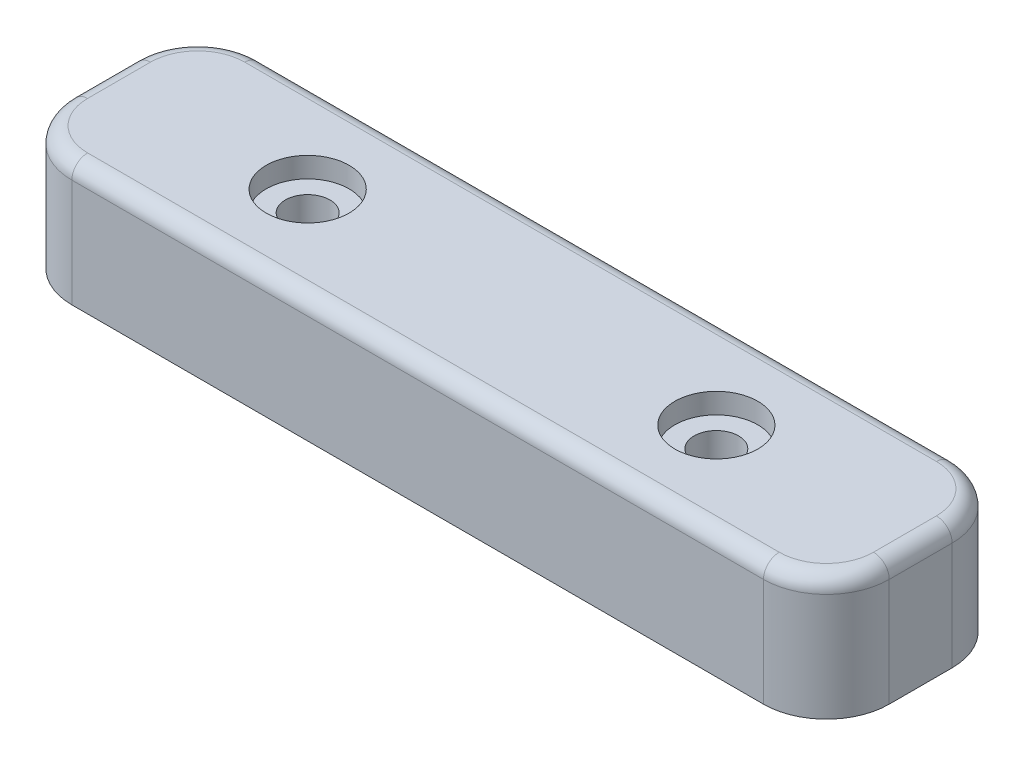
ISO-10303-21;
HEADER;
FILE_DESCRIPTION(('STEP AP214'),'2;1');
FILE_NAME('part.step','',(''),(''),'','','');
FILE_SCHEMA(('AUTOMOTIVE_DESIGN { 1 0 10303 214 1 1 1 1 }'));
ENDSEC;
DATA;
#1=APPLICATION_CONTEXT('core data for automotive mechanical design processes');
#2=APPLICATION_PROTOCOL_DEFINITION('international standard','automotive_design',2000,#1);
#3=PRODUCT_CONTEXT('',#1,'mechanical');
#4=PRODUCT('Part','Part','',(#3));
#5=PRODUCT_RELATED_PRODUCT_CATEGORY('part','',(#4));
#6=PRODUCT_DEFINITION_FORMATION('','',#4);
#7=PRODUCT_DEFINITION_CONTEXT('part definition',#1,'design');
#8=PRODUCT_DEFINITION('design','',#6,#7);
#9=PRODUCT_DEFINITION_SHAPE('','',#8);
#10=(LENGTH_UNIT() NAMED_UNIT(*) SI_UNIT(.MILLI.,.METRE.));
#11=(NAMED_UNIT(*) PLANE_ANGLE_UNIT() SI_UNIT($,.RADIAN.));
#12=(NAMED_UNIT(*) SI_UNIT($,.STERADIAN.) SOLID_ANGLE_UNIT());
#13=UNCERTAINTY_MEASURE_WITH_UNIT(LENGTH_MEASURE(1.E-05),#10,'distance_accuracy_value','');
#14=(GEOMETRIC_REPRESENTATION_CONTEXT(3) GLOBAL_UNCERTAINTY_ASSIGNED_CONTEXT((#13)) GLOBAL_UNIT_ASSIGNED_CONTEXT((#10,
#11,#12)) REPRESENTATION_CONTEXT('',''));
#15=CARTESIAN_POINT('',(0.,0.,0.));
#16=DIRECTION('',(0.,0.,1.));
#17=DIRECTION('',(1.,0.,0.));
#18=AXIS2_PLACEMENT_3D('',#15,#16,#17);
#19=CARTESIAN_POINT('',(0.,10.,0.));
#20=DIRECTION('',(1.,0.,0.));
#21=DIRECTION('',(0.,0.,-1.));
#22=AXIS2_PLACEMENT_3D('',#19,#20,#21);
#23=PLANE('',#22);
#24=DIRECTION('',(0.,-1.,0.));
#25=VECTOR('',#24,1.);
#26=CARTESIAN_POINT('',(0.,10.,10.16));
#27=LINE('',#26,#25);
#28=CARTESIAN_POINT('',(0.,0.,10.16));
#29=VERTEX_POINT('',#28);
#30=CARTESIAN_POINT('',(0.,8.73,10.16));
#31=VERTEX_POINT('',#30);
#32=EDGE_CURVE('E144',#29,#31,#27,.F.);
#33=ORIENTED_EDGE('',*,*,#32,.T.);
#34=DIRECTION('',(0.,0.,1.));
#35=VECTOR('',#34,1.);
#36=CARTESIAN_POINT('',(0.,8.73,5.08));
#37=LINE('',#36,#35);
#38=CARTESIAN_POINT('',(0.,8.73,5.08));
#39=VERTEX_POINT('',#38);
#40=EDGE_CURVE('E201',#31,#39,#37,.F.);
#41=ORIENTED_EDGE('',*,*,#40,.T.);
#42=DIRECTION('',(0.,-1.,0.));
#43=VECTOR('',#42,1.);
#44=CARTESIAN_POINT('',(0.,10.,5.08));
#45=LINE('',#44,#43);
#46=CARTESIAN_POINT('',(0.,0.,5.08));
#47=VERTEX_POINT('',#46);
#48=EDGE_CURVE('E148',#39,#47,#45,.T.);
#49=ORIENTED_EDGE('',*,*,#48,.T.);
#50=DIRECTION('',(0.,0.,1.));
#51=VECTOR('',#50,1.);
#52=CARTESIAN_POINT('',(0.,0.,0.));
#53=LINE('',#52,#51);
#54=EDGE_CURVE('E156',#47,#29,#53,.T.);
#55=ORIENTED_EDGE('',*,*,#54,.T.);
#56=EDGE_LOOP('',(#33,#41,#49,#55));
#57=FACE_BOUND('',#56,.T.);
#58=ADVANCED_FACE('F37',(#57),#23,.F.);
#59=CARTESIAN_POINT('',(0.,10.,15.24));
#60=DIRECTION('',(0.,0.,-1.));
#61=DIRECTION('',(-1.,0.,0.));
#62=AXIS2_PLACEMENT_3D('',#59,#60,#61);
#63=PLANE('',#62);
#64=DIRECTION('',(0.,-1.,0.));
#65=VECTOR('',#64,1.);
#66=CARTESIAN_POINT('',(60.96,10.,15.24));
#67=LINE('',#66,#65);
#68=CARTESIAN_POINT('',(60.96,0.,15.24));
#69=VERTEX_POINT('',#68);
#70=CARTESIAN_POINT('',(60.96,8.73,15.24));
#71=VERTEX_POINT('',#70);
#72=EDGE_CURVE('E138',#69,#71,#67,.F.);
#73=ORIENTED_EDGE('',*,*,#72,.T.);
#74=DIRECTION('',(1.,0.,0.));
#75=VECTOR('',#74,1.);
#76=CARTESIAN_POINT('',(5.08,8.73,15.24));
#77=LINE('',#76,#75);
#78=CARTESIAN_POINT('',(5.08,8.73,15.24));
#79=VERTEX_POINT('',#78);
#80=EDGE_CURVE('E11',#71,#79,#77,.F.);
#81=ORIENTED_EDGE('',*,*,#80,.T.);
#82=DIRECTION('',(0.,-1.,0.));
#83=VECTOR('',#82,1.);
#84=CARTESIAN_POINT('',(5.08,10.,15.24));
#85=LINE('',#84,#83);
#86=CARTESIAN_POINT('',(5.08,0.,15.24));
#87=VERTEX_POINT('',#86);
#88=EDGE_CURVE('E128',#79,#87,#85,.T.);
#89=ORIENTED_EDGE('',*,*,#88,.T.);
#90=DIRECTION('',(1.,0.,0.));
#91=VECTOR('',#90,1.);
#92=CARTESIAN_POINT('',(0.,0.,15.24));
#93=LINE('',#92,#91);
#94=EDGE_CURVE('E132',#87,#69,#93,.T.);
#95=ORIENTED_EDGE('',*,*,#94,.T.);
#96=EDGE_LOOP('',(#73,#81,#89,#95));
#97=FACE_BOUND('',#96,.T.);
#98=ADVANCED_FACE('F130',(#97),#63,.F.);
#99=CARTESIAN_POINT('',(66.04,10.,0.));
#100=DIRECTION('',(-1.,0.,0.));
#101=DIRECTION('',(0.,0.,1.));
#102=AXIS2_PLACEMENT_3D('',#99,#100,#101);
#103=PLANE('',#102);
#104=DIRECTION('',(0.,-1.,0.));
#105=VECTOR('',#104,1.);
#106=CARTESIAN_POINT('',(66.04,10.,5.08));
#107=LINE('',#106,#105);
#108=CARTESIAN_POINT('',(66.04,0.,5.08));
#109=VERTEX_POINT('',#108);
#110=CARTESIAN_POINT('',(66.04,8.73,5.08));
#111=VERTEX_POINT('',#110);
#112=EDGE_CURVE('E178',#109,#111,#107,.F.);
#113=ORIENTED_EDGE('',*,*,#112,.T.);
#114=DIRECTION('',(0.,0.,-1.));
#115=VECTOR('',#114,1.);
#116=CARTESIAN_POINT('',(66.04,8.73,10.16));
#117=LINE('',#116,#115);
#118=CARTESIAN_POINT('',(66.04,8.73,10.16));
#119=VERTEX_POINT('',#118);
#120=EDGE_CURVE('E61',#111,#119,#117,.F.);
#121=ORIENTED_EDGE('',*,*,#120,.T.);
#122=DIRECTION('',(0.,-1.,0.));
#123=VECTOR('',#122,1.);
#124=CARTESIAN_POINT('',(66.04,10.,10.16));
#125=LINE('',#124,#123);
#126=CARTESIAN_POINT('',(66.04,0.,10.16));
#127=VERTEX_POINT('',#126);
#128=EDGE_CURVE('E180',#119,#127,#125,.T.);
#129=ORIENTED_EDGE('',*,*,#128,.T.);
#130=DIRECTION('',(0.,0.,-1.));
#131=VECTOR('',#130,1.);
#132=CARTESIAN_POINT('',(66.04,0.,0.));
#133=LINE('',#132,#131);
#134=EDGE_CURVE('E155',#127,#109,#133,.T.);
#135=ORIENTED_EDGE('',*,*,#134,.T.);
#136=EDGE_LOOP('',(#113,#121,#129,#135));
#137=FACE_BOUND('',#136,.T.);
#138=ADVANCED_FACE('F293',(#137),#103,.F.);
#139=CARTESIAN_POINT('',(0.,10.,0.));
#140=DIRECTION('',(0.,0.,1.));
#141=DIRECTION('',(1.,0.,0.));
#142=AXIS2_PLACEMENT_3D('',#139,#140,#141);
#143=PLANE('',#142);
#144=DIRECTION('',(0.,-1.,0.));
#145=VECTOR('',#144,1.);
#146=CARTESIAN_POINT('',(5.08,10.,0.));
#147=LINE('',#146,#145);
#148=CARTESIAN_POINT('',(5.08,0.,0.));
#149=VERTEX_POINT('',#148);
#150=CARTESIAN_POINT('',(5.08,8.73,0.));
#151=VERTEX_POINT('',#150);
#152=EDGE_CURVE('E175',#149,#151,#147,.F.);
#153=ORIENTED_EDGE('',*,*,#152,.T.);
#154=DIRECTION('',(-1.,0.,0.));
#155=VECTOR('',#154,1.);
#156=CARTESIAN_POINT('',(60.96,8.73,0.));
#157=LINE('',#156,#155);
#158=CARTESIAN_POINT('',(60.96,8.73,0.));
#159=VERTEX_POINT('',#158);
#160=EDGE_CURVE('E205',#151,#159,#157,.F.);
#161=ORIENTED_EDGE('',*,*,#160,.T.);
#162=DIRECTION('',(0.,-1.,0.));
#163=VECTOR('',#162,1.);
#164=CARTESIAN_POINT('',(60.96,10.,0.));
#165=LINE('',#164,#163);
#166=CARTESIAN_POINT('',(60.96,0.,0.));
#167=VERTEX_POINT('',#166);
#168=EDGE_CURVE('E173',#159,#167,#165,.T.);
#169=ORIENTED_EDGE('',*,*,#168,.T.);
#170=DIRECTION('',(-1.,0.,0.));
#171=VECTOR('',#170,1.);
#172=CARTESIAN_POINT('',(0.,0.,0.));
#173=LINE('',#172,#171);
#174=EDGE_CURVE('E159',#167,#149,#173,.T.);
#175=ORIENTED_EDGE('',*,*,#174,.T.);
#176=EDGE_LOOP('',(#153,#161,#169,#175));
#177=FACE_BOUND('',#176,.T.);
#178=ADVANCED_FACE('F284',(#177),#143,.F.);
#179=CARTESIAN_POINT('',(0.,10.,0.));
#180=DIRECTION('',(0.,1.,0.));
#181=DIRECTION('',(0.,0.,1.));
#182=AXIS2_PLACEMENT_3D('',#179,#180,#181);
#183=PLANE('',#182);
#184=DIRECTION('',(0.,0.,1.));
#185=VECTOR('',#184,1.);
#186=CARTESIAN_POINT('',(1.27,10.,10.16));
#187=LINE('',#186,#185);
#188=CARTESIAN_POINT('',(1.27,10.,5.08));
#189=VERTEX_POINT('',#188);
#190=CARTESIAN_POINT('',(1.27,10.,10.16));
#191=VERTEX_POINT('',#190);
#192=EDGE_CURVE('E194',#189,#191,#187,.T.);
#193=ORIENTED_EDGE('',*,*,#192,.T.);
#194=CARTESIAN_POINT('',(5.08,10.,10.16));
#195=DIRECTION('',(0.,1.,0.));
#196=DIRECTION('',(0.,0.,1.));
#197=AXIS2_PLACEMENT_3D('',#194,#195,#196);
#198=CIRCLE('',#197,3.81);
#199=CARTESIAN_POINT('',(5.08,10.,13.97));
#200=VERTEX_POINT('',#199);
#201=EDGE_CURVE('E196',#191,#200,#198,.T.);
#202=ORIENTED_EDGE('',*,*,#201,.T.);
#203=DIRECTION('',(1.,0.,0.));
#204=VECTOR('',#203,1.);
#205=CARTESIAN_POINT('',(60.96,10.,13.97));
#206=LINE('',#205,#204);
#207=CARTESIAN_POINT('',(60.96,10.,13.97));
#208=VERTEX_POINT('',#207);
#209=EDGE_CURVE('E182',#200,#208,#206,.T.);
#210=ORIENTED_EDGE('',*,*,#209,.T.);
#211=CARTESIAN_POINT('',(60.96,10.,10.16));
#212=DIRECTION('',(0.,1.,0.));
#213=DIRECTION('',(0.,0.,1.));
#214=AXIS2_PLACEMENT_3D('',#211,#212,#213);
#215=CIRCLE('',#214,3.81);
#216=CARTESIAN_POINT('',(64.77,10.,10.16));
#217=VERTEX_POINT('',#216);
#218=EDGE_CURVE('E184',#208,#217,#215,.T.);
#219=ORIENTED_EDGE('',*,*,#218,.T.);
#220=DIRECTION('',(0.,0.,-1.));
#221=VECTOR('',#220,1.);
#222=CARTESIAN_POINT('',(64.77,10.,5.08));
#223=LINE('',#222,#221);
#224=CARTESIAN_POINT('',(64.77,10.,5.08));
#225=VERTEX_POINT('',#224);
#226=EDGE_CURVE('E186',#217,#225,#223,.T.);
#227=ORIENTED_EDGE('',*,*,#226,.T.);
#228=CARTESIAN_POINT('',(60.96,10.,5.08));
#229=DIRECTION('',(0.,1.,0.));
#230=DIRECTION('',(0.,0.,1.));
#231=AXIS2_PLACEMENT_3D('',#228,#229,#230);
#232=CIRCLE('',#231,3.81);
#233=CARTESIAN_POINT('',(60.96,10.,1.27));
#234=VERTEX_POINT('',#233);
#235=EDGE_CURVE('E188',#225,#234,#232,.T.);
#236=ORIENTED_EDGE('',*,*,#235,.T.);
#237=DIRECTION('',(-1.,0.,0.));
#238=VECTOR('',#237,1.);
#239=CARTESIAN_POINT('',(5.08,10.,1.27));
#240=LINE('',#239,#238);
#241=CARTESIAN_POINT('',(5.08,10.,1.27));
#242=VERTEX_POINT('',#241);
#243=EDGE_CURVE('E190',#234,#242,#240,.T.);
#244=ORIENTED_EDGE('',*,*,#243,.T.);
#245=CARTESIAN_POINT('',(5.08,10.,5.08));
#246=DIRECTION('',(0.,1.,0.));
#247=DIRECTION('',(0.,0.,1.));
#248=AXIS2_PLACEMENT_3D('',#245,#246,#247);
#249=CIRCLE('',#248,3.81);
#250=EDGE_CURVE('E192',#242,#189,#249,.T.);
#251=ORIENTED_EDGE('',*,*,#250,.T.);
#252=EDGE_LOOP('',(#193,#202,#210,#219,#227,#236,#244,#251));
#253=FACE_BOUND('',#252,.T.);
#254=CARTESIAN_POINT('',(16.51,10.,7.62));
#255=DIRECTION('',(0.,1.,0.));
#256=DIRECTION('',(0.,0.,1.));
#257=AXIS2_PLACEMENT_3D('',#254,#255,#256);
#258=CIRCLE('',#257,3.35);
#259=CARTESIAN_POINT('',(16.51,10.,10.97));
#260=VERTEX_POINT('',#259);
#261=EDGE_CURVE('E232',#260,#260,#258,.T.);
#262=ORIENTED_EDGE('',*,*,#261,.F.);
#263=EDGE_LOOP('',(#262));
#264=FACE_BOUND('',#263,.T.);
#265=CARTESIAN_POINT('',(49.53,10.,7.62));
#266=DIRECTION('',(0.,1.,0.));
#267=DIRECTION('',(0.,0.,1.));
#268=AXIS2_PLACEMENT_3D('',#265,#266,#267);
#269=CIRCLE('',#268,3.35);
#270=CARTESIAN_POINT('',(49.53,10.,10.97));
#271=VERTEX_POINT('',#270);
#272=EDGE_CURVE('E251',#271,#271,#269,.T.);
#273=ORIENTED_EDGE('',*,*,#272,.F.);
#274=EDGE_LOOP('',(#273));
#275=FACE_BOUND('',#274,.T.);
#276=ADVANCED_FACE('F282',(#253,#264,#275),#183,.T.);
#277=CARTESIAN_POINT('',(0.,0.,0.));
#278=DIRECTION('',(0.,1.,0.));
#279=DIRECTION('',(0.,0.,1.));
#280=AXIS2_PLACEMENT_3D('',#277,#278,#279);
#281=PLANE('',#280);
#282=CARTESIAN_POINT('',(16.51,0.,7.62));
#283=DIRECTION('',(0.,1.,0.));
#284=DIRECTION('',(0.,0.,1.));
#285=AXIS2_PLACEMENT_3D('',#282,#283,#284);
#286=CIRCLE('',#285,1.8);
#287=CARTESIAN_POINT('',(16.51,0.,9.41999999999999));
#288=VERTEX_POINT('',#287);
#289=EDGE_CURVE('E248',#288,#288,#286,.T.);
#290=ORIENTED_EDGE('',*,*,#289,.T.);
#291=EDGE_LOOP('',(#290));
#292=FACE_BOUND('',#291,.T.);
#293=CARTESIAN_POINT('',(49.53,0.,7.62));
#294=DIRECTION('',(0.,1.,0.));
#295=DIRECTION('',(0.,0.,1.));
#296=AXIS2_PLACEMENT_3D('',#293,#294,#295);
#297=CIRCLE('',#296,1.8);
#298=CARTESIAN_POINT('',(49.53,0.,9.41999999999999));
#299=VERTEX_POINT('',#298);
#300=EDGE_CURVE('E161',#299,#299,#297,.T.);
#301=ORIENTED_EDGE('',*,*,#300,.T.);
#302=EDGE_LOOP('',(#301));
#303=FACE_BOUND('',#302,.T.);
#304=ORIENTED_EDGE('',*,*,#94,.F.);
#305=CARTESIAN_POINT('',(5.08,0.,10.16));
#306=DIRECTION('',(0.,1.,0.));
#307=DIRECTION('',(0.,0.,1.));
#308=AXIS2_PLACEMENT_3D('',#305,#306,#307);
#309=CIRCLE('',#308,5.08);
#310=EDGE_CURVE('E141',#87,#29,#309,.F.);
#311=ORIENTED_EDGE('',*,*,#310,.T.);
#312=ORIENTED_EDGE('',*,*,#54,.F.);
#313=CARTESIAN_POINT('',(5.08,0.,5.08));
#314=DIRECTION('',(0.,1.,0.));
#315=DIRECTION('',(0.,0.,1.));
#316=AXIS2_PLACEMENT_3D('',#313,#314,#315);
#317=CIRCLE('',#316,5.08);
#318=EDGE_CURVE('E149',#47,#149,#317,.F.);
#319=ORIENTED_EDGE('',*,*,#318,.T.);
#320=ORIENTED_EDGE('',*,*,#174,.F.);
#321=CARTESIAN_POINT('',(60.96,0.,5.08));
#322=DIRECTION('',(0.,1.,0.));
#323=DIRECTION('',(0.,0.,1.));
#324=AXIS2_PLACEMENT_3D('',#321,#322,#323);
#325=CIRCLE('',#324,5.08);
#326=EDGE_CURVE('E137',#167,#109,#325,.F.);
#327=ORIENTED_EDGE('',*,*,#326,.T.);
#328=ORIENTED_EDGE('',*,*,#134,.F.);
#329=CARTESIAN_POINT('',(60.96,0.,10.16));
#330=DIRECTION('',(0.,1.,0.));
#331=DIRECTION('',(0.,0.,1.));
#332=AXIS2_PLACEMENT_3D('',#329,#330,#331);
#333=CIRCLE('',#332,5.08);
#334=EDGE_CURVE('E154',#127,#69,#333,.F.);
#335=ORIENTED_EDGE('',*,*,#334,.T.);
#336=EDGE_LOOP('',(#304,#311,#312,#319,#320,#327,#328,#335));
#337=FACE_BOUND('',#336,.T.);
#338=ADVANCED_FACE('F151',(#292,#303,#337),#281,.F.);
#339=CARTESIAN_POINT('',(49.53,10.,7.62));
#340=DIRECTION('',(0.,1.,0.));
#341=DIRECTION('',(0.,0.,1.));
#342=AXIS2_PLACEMENT_3D('',#339,#340,#341);
#343=CYLINDRICAL_SURFACE('',#342,1.8);
#344=ORIENTED_EDGE('',*,*,#300,.F.);
#345=EDGE_LOOP('',(#344));
#346=FACE_BOUND('',#345,.T.);
#347=CARTESIAN_POINT('',(49.53,8.35,7.62));
#348=DIRECTION('',(0.,1.,0.));
#349=DIRECTION('',(0.,0.,1.));
#350=AXIS2_PLACEMENT_3D('',#347,#348,#349);
#351=CIRCLE('',#350,1.8);
#352=CARTESIAN_POINT('',(49.53,8.35,9.42));
#353=VERTEX_POINT('',#352);
#354=EDGE_CURVE('E257',#353,#353,#351,.T.);
#355=ORIENTED_EDGE('',*,*,#354,.T.);
#356=EDGE_LOOP('',(#355));
#357=FACE_BOUND('',#356,.T.);
#358=ADVANCED_FACE('F263',(#346,#357),#343,.F.);
#359=CARTESIAN_POINT('',(51.33,8.35,7.62));
#360=DIRECTION('',(0.,-1.,0.));
#361=DIRECTION('',(0.,0.,-1.));
#362=AXIS2_PLACEMENT_3D('',#359,#360,#361);
#363=PLANE('',#362);
#364=ORIENTED_EDGE('',*,*,#354,.F.);
#365=EDGE_LOOP('',(#364));
#366=FACE_BOUND('',#365,.T.);
#367=CARTESIAN_POINT('',(49.53,8.35,7.62));
#368=DIRECTION('',(0.,1.,0.));
#369=DIRECTION('',(0.,0.,1.));
#370=AXIS2_PLACEMENT_3D('',#367,#368,#369);
#371=CIRCLE('',#370,3.35);
#372=CARTESIAN_POINT('',(49.53,8.35,10.97));
#373=VERTEX_POINT('',#372);
#374=EDGE_CURVE('E254',#373,#373,#371,.T.);
#375=ORIENTED_EDGE('',*,*,#374,.T.);
#376=EDGE_LOOP('',(#375));
#377=FACE_BOUND('',#376,.T.);
#378=ADVANCED_FACE('F266',(#366,#377),#363,.F.);
#379=CARTESIAN_POINT('',(49.53,10.,7.62));
#380=DIRECTION('',(0.,1.,0.));
#381=DIRECTION('',(0.,0.,1.));
#382=AXIS2_PLACEMENT_3D('',#379,#380,#381);
#383=CYLINDRICAL_SURFACE('',#382,3.35);
#384=ORIENTED_EDGE('',*,*,#374,.F.);
#385=EDGE_LOOP('',(#384));
#386=FACE_BOUND('',#385,.T.);
#387=ORIENTED_EDGE('',*,*,#272,.T.);
#388=EDGE_LOOP('',(#387));
#389=FACE_BOUND('',#388,.T.);
#390=ADVANCED_FACE('F272',(#386,#389),#383,.F.);
#391=CARTESIAN_POINT('',(16.51,10.,7.62));
#392=DIRECTION('',(0.,1.,0.));
#393=DIRECTION('',(0.,0.,1.));
#394=AXIS2_PLACEMENT_3D('',#391,#392,#393);
#395=CYLINDRICAL_SURFACE('',#394,1.8);
#396=ORIENTED_EDGE('',*,*,#289,.F.);
#397=EDGE_LOOP('',(#396));
#398=FACE_BOUND('',#397,.T.);
#399=CARTESIAN_POINT('',(16.51,8.35,7.62));
#400=DIRECTION('',(0.,1.,0.));
#401=DIRECTION('',(0.,0.,1.));
#402=AXIS2_PLACEMENT_3D('',#399,#400,#401);
#403=CIRCLE('',#402,1.8);
#404=CARTESIAN_POINT('',(16.51,8.35,9.42));
#405=VERTEX_POINT('',#404);
#406=EDGE_CURVE('E243',#405,#405,#403,.T.);
#407=ORIENTED_EDGE('',*,*,#406,.T.);
#408=EDGE_LOOP('',(#407));
#409=FACE_BOUND('',#408,.T.);
#410=ADVANCED_FACE('F278',(#398,#409),#395,.F.);
#411=CARTESIAN_POINT('',(18.31,8.35,7.62));
#412=DIRECTION('',(0.,-1.,0.));
#413=DIRECTION('',(0.,0.,-1.));
#414=AXIS2_PLACEMENT_3D('',#411,#412,#413);
#415=PLANE('',#414);
#416=ORIENTED_EDGE('',*,*,#406,.F.);
#417=EDGE_LOOP('',(#416));
#418=FACE_BOUND('',#417,.T.);
#419=CARTESIAN_POINT('',(16.51,8.35,7.62));
#420=DIRECTION('',(0.,1.,0.));
#421=DIRECTION('',(0.,0.,1.));
#422=AXIS2_PLACEMENT_3D('',#419,#420,#421);
#423=CIRCLE('',#422,3.35);
#424=CARTESIAN_POINT('',(16.51,8.35,10.97));
#425=VERTEX_POINT('',#424);
#426=EDGE_CURVE('E238',#425,#425,#423,.T.);
#427=ORIENTED_EDGE('',*,*,#426,.T.);
#428=EDGE_LOOP('',(#427));
#429=FACE_BOUND('',#428,.T.);
#430=ADVANCED_FACE('F463',(#418,#429),#415,.F.);
#431=CARTESIAN_POINT('',(16.51,10.,7.62));
#432=DIRECTION('',(0.,1.,0.));
#433=DIRECTION('',(0.,0.,1.));
#434=AXIS2_PLACEMENT_3D('',#431,#432,#433);
#435=CYLINDRICAL_SURFACE('',#434,3.35);
#436=ORIENTED_EDGE('',*,*,#426,.F.);
#437=EDGE_LOOP('',(#436));
#438=FACE_BOUND('',#437,.T.);
#439=ORIENTED_EDGE('',*,*,#261,.T.);
#440=EDGE_LOOP('',(#439));
#441=FACE_BOUND('',#440,.T.);
#442=ADVANCED_FACE('F309',(#438,#441),#435,.F.);
#443=CARTESIAN_POINT('',(5.08,10.,10.16));
#444=DIRECTION('',(0.,-1.,0.));
#445=DIRECTION('',(0.,0.,-1.));
#446=AXIS2_PLACEMENT_3D('',#443,#444,#445);
#447=CYLINDRICAL_SURFACE('',#446,5.08);
#448=ORIENTED_EDGE('',*,*,#88,.F.);
#449=CARTESIAN_POINT('',(5.08,8.73,10.16));
#450=DIRECTION('',(0.,1.,0.));
#451=DIRECTION('',(0.,0.,1.));
#452=AXIS2_PLACEMENT_3D('',#449,#450,#451);
#453=CIRCLE('',#452,5.08);
#454=EDGE_CURVE('E199',#79,#31,#453,.F.);
#455=ORIENTED_EDGE('',*,*,#454,.T.);
#456=ORIENTED_EDGE('',*,*,#32,.F.);
#457=ORIENTED_EDGE('',*,*,#310,.F.);
#458=EDGE_LOOP('',(#448,#455,#456,#457));
#459=FACE_BOUND('',#458,.T.);
#460=ADVANCED_FACE('F142',(#459),#447,.T.);
#461=CARTESIAN_POINT('',(5.08,10.,5.08));
#462=DIRECTION('',(0.,-1.,0.));
#463=DIRECTION('',(0.,0.,-1.));
#464=AXIS2_PLACEMENT_3D('',#461,#462,#463);
#465=CYLINDRICAL_SURFACE('',#464,5.08);
#466=ORIENTED_EDGE('',*,*,#48,.F.);
#467=CARTESIAN_POINT('',(5.08,8.73,5.08));
#468=DIRECTION('',(0.,1.,0.));
#469=DIRECTION('',(0.,0.,1.));
#470=AXIS2_PLACEMENT_3D('',#467,#468,#469);
#471=CIRCLE('',#470,5.08);
#472=EDGE_CURVE('E203',#39,#151,#471,.F.);
#473=ORIENTED_EDGE('',*,*,#472,.T.);
#474=ORIENTED_EDGE('',*,*,#152,.F.);
#475=ORIENTED_EDGE('',*,*,#318,.F.);
#476=EDGE_LOOP('',(#466,#473,#474,#475));
#477=FACE_BOUND('',#476,.T.);
#478=ADVANCED_FACE('F308',(#477),#465,.T.);
#479=CARTESIAN_POINT('',(60.96,10.,10.16));
#480=DIRECTION('',(0.,-1.,0.));
#481=DIRECTION('',(0.,0.,-1.));
#482=AXIS2_PLACEMENT_3D('',#479,#480,#481);
#483=CYLINDRICAL_SURFACE('',#482,5.08);
#484=ORIENTED_EDGE('',*,*,#128,.F.);
#485=CARTESIAN_POINT('',(60.96,8.73,10.16));
#486=DIRECTION('',(0.,1.,0.));
#487=DIRECTION('',(0.,0.,1.));
#488=AXIS2_PLACEMENT_3D('',#485,#486,#487);
#489=CIRCLE('',#488,5.08);
#490=EDGE_CURVE('E46',#119,#71,#489,.F.);
#491=ORIENTED_EDGE('',*,*,#490,.T.);
#492=ORIENTED_EDGE('',*,*,#72,.F.);
#493=ORIENTED_EDGE('',*,*,#334,.F.);
#494=EDGE_LOOP('',(#484,#491,#492,#493));
#495=FACE_BOUND('',#494,.T.);
#496=ADVANCED_FACE('F312',(#495),#483,.T.);
#497=CARTESIAN_POINT('',(60.96,10.,5.08));
#498=DIRECTION('',(0.,-1.,0.));
#499=DIRECTION('',(0.,0.,-1.));
#500=AXIS2_PLACEMENT_3D('',#497,#498,#499);
#501=CYLINDRICAL_SURFACE('',#500,5.08);
#502=ORIENTED_EDGE('',*,*,#168,.F.);
#503=CARTESIAN_POINT('',(60.96,8.73,5.08));
#504=DIRECTION('',(0.,1.,0.));
#505=DIRECTION('',(0.,0.,1.));
#506=AXIS2_PLACEMENT_3D('',#503,#504,#505);
#507=CIRCLE('',#506,5.08);
#508=EDGE_CURVE('E207',#159,#111,#507,.F.);
#509=ORIENTED_EDGE('',*,*,#508,.T.);
#510=ORIENTED_EDGE('',*,*,#112,.F.);
#511=ORIENTED_EDGE('',*,*,#326,.F.);
#512=EDGE_LOOP('',(#502,#509,#510,#511));
#513=FACE_BOUND('',#512,.T.);
#514=ADVANCED_FACE('F316',(#513),#501,.T.);
#515=CARTESIAN_POINT('',(60.96,8.73,5.08));
#516=DIRECTION('',(0.,1.,0.));
#517=DIRECTION('',(0.,0.,1.));
#518=AXIS2_PLACEMENT_3D('',#515,#516,#517);
#519=TOROIDAL_SURFACE('',#518,3.81,1.27);
#520=CARTESIAN_POINT('',(64.77,8.73,5.08));
#521=DIRECTION('',(0.,0.,1.));
#522=DIRECTION('',(1.,0.,0.));
#523=AXIS2_PLACEMENT_3D('',#520,#521,#522);
#524=CIRCLE('',#523,1.27);
#525=EDGE_CURVE('E226',#111,#225,#524,.T.);
#526=ORIENTED_EDGE('',*,*,#525,.F.);
#527=ORIENTED_EDGE('',*,*,#508,.F.);
#528=CARTESIAN_POINT('',(60.96,8.73,1.27));
#529=DIRECTION('',(-1.,0.,0.));
#530=DIRECTION('',(0.,0.,1.));
#531=AXIS2_PLACEMENT_3D('',#528,#529,#530);
#532=CIRCLE('',#531,1.27);
#533=EDGE_CURVE('E41',#234,#159,#532,.T.);
#534=ORIENTED_EDGE('',*,*,#533,.F.);
#535=ORIENTED_EDGE('',*,*,#235,.F.);
#536=EDGE_LOOP('',(#526,#527,#534,#535));
#537=FACE_BOUND('',#536,.T.);
#538=ADVANCED_FACE('F39',(#537),#519,.T.);
#539=CARTESIAN_POINT('',(0.,8.73,1.27));
#540=DIRECTION('',(1.,0.,0.));
#541=DIRECTION('',(0.,0.,-1.));
#542=AXIS2_PLACEMENT_3D('',#539,#540,#541);
#543=CYLINDRICAL_SURFACE('',#542,1.27);
#544=ORIENTED_EDGE('',*,*,#533,.T.);
#545=ORIENTED_EDGE('',*,*,#160,.F.);
#546=CARTESIAN_POINT('',(5.08,8.73,1.27));
#547=DIRECTION('',(-1.,0.,0.));
#548=DIRECTION('',(0.,0.,1.));
#549=AXIS2_PLACEMENT_3D('',#546,#547,#548);
#550=CIRCLE('',#549,1.27);
#551=EDGE_CURVE('E224',#242,#151,#550,.T.);
#552=ORIENTED_EDGE('',*,*,#551,.F.);
#553=ORIENTED_EDGE('',*,*,#243,.F.);
#554=EDGE_LOOP('',(#544,#545,#552,#553));
#555=FACE_BOUND('',#554,.T.);
#556=ADVANCED_FACE('F342',(#555),#543,.T.);
#557=CARTESIAN_POINT('',(64.77,8.73,0.));
#558=DIRECTION('',(0.,0.,1.));
#559=DIRECTION('',(1.,0.,0.));
#560=AXIS2_PLACEMENT_3D('',#557,#558,#559);
#561=CYLINDRICAL_SURFACE('',#560,1.27);
#562=ORIENTED_EDGE('',*,*,#525,.T.);
#563=ORIENTED_EDGE('',*,*,#226,.F.);
#564=CARTESIAN_POINT('',(64.77,8.73,10.16));
#565=DIRECTION('',(0.,0.,1.));
#566=DIRECTION('',(1.,0.,0.));
#567=AXIS2_PLACEMENT_3D('',#564,#565,#566);
#568=CIRCLE('',#567,1.27);
#569=EDGE_CURVE('E221',#119,#217,#568,.T.);
#570=ORIENTED_EDGE('',*,*,#569,.F.);
#571=ORIENTED_EDGE('',*,*,#120,.F.);
#572=EDGE_LOOP('',(#562,#563,#570,#571));
#573=FACE_BOUND('',#572,.T.);
#574=ADVANCED_FACE('F339',(#573),#561,.T.);
#575=CARTESIAN_POINT('',(5.08,8.73,5.08));
#576=DIRECTION('',(0.,1.,0.));
#577=DIRECTION('',(0.,0.,1.));
#578=AXIS2_PLACEMENT_3D('',#575,#576,#577);
#579=TOROIDAL_SURFACE('',#578,3.81,1.27);
#580=ORIENTED_EDGE('',*,*,#551,.T.);
#581=ORIENTED_EDGE('',*,*,#472,.F.);
#582=CARTESIAN_POINT('',(1.27,8.73,5.08));
#583=DIRECTION('',(0.,0.,1.));
#584=DIRECTION('',(1.,0.,0.));
#585=AXIS2_PLACEMENT_3D('',#582,#583,#584);
#586=CIRCLE('',#585,1.27);
#587=EDGE_CURVE('E218',#189,#39,#586,.T.);
#588=ORIENTED_EDGE('',*,*,#587,.F.);
#589=ORIENTED_EDGE('',*,*,#250,.F.);
#590=EDGE_LOOP('',(#580,#581,#588,#589));
#591=FACE_BOUND('',#590,.T.);
#592=ADVANCED_FACE('F335',(#591),#579,.T.);
#593=CARTESIAN_POINT('',(60.96,8.73,10.16));
#594=DIRECTION('',(0.,1.,0.));
#595=DIRECTION('',(0.,0.,1.));
#596=AXIS2_PLACEMENT_3D('',#593,#594,#595);
#597=TOROIDAL_SURFACE('',#596,3.81,1.27);
#598=ORIENTED_EDGE('',*,*,#569,.T.);
#599=ORIENTED_EDGE('',*,*,#218,.F.);
#600=CARTESIAN_POINT('',(60.96,8.73,13.97));
#601=DIRECTION('',(-1.,0.,0.));
#602=DIRECTION('',(0.,0.,1.));
#603=AXIS2_PLACEMENT_3D('',#600,#601,#602);
#604=CIRCLE('',#603,1.27);
#605=EDGE_CURVE('E215',#71,#208,#604,.T.);
#606=ORIENTED_EDGE('',*,*,#605,.F.);
#607=ORIENTED_EDGE('',*,*,#490,.F.);
#608=EDGE_LOOP('',(#598,#599,#606,#607));
#609=FACE_BOUND('',#608,.T.);
#610=ADVANCED_FACE('F331',(#609),#597,.T.);
#611=CARTESIAN_POINT('',(1.27,8.73,0.));
#612=DIRECTION('',(0.,0.,-1.));
#613=DIRECTION('',(-1.,0.,0.));
#614=AXIS2_PLACEMENT_3D('',#611,#612,#613);
#615=CYLINDRICAL_SURFACE('',#614,1.27);
#616=ORIENTED_EDGE('',*,*,#587,.T.);
#617=ORIENTED_EDGE('',*,*,#40,.F.);
#618=CARTESIAN_POINT('',(1.27,8.73,10.16));
#619=DIRECTION('',(0.,0.,1.));
#620=DIRECTION('',(1.,0.,0.));
#621=AXIS2_PLACEMENT_3D('',#618,#619,#620);
#622=CIRCLE('',#621,1.27);
#623=EDGE_CURVE('E213',#191,#31,#622,.T.);
#624=ORIENTED_EDGE('',*,*,#623,.F.);
#625=ORIENTED_EDGE('',*,*,#192,.F.);
#626=EDGE_LOOP('',(#616,#617,#624,#625));
#627=FACE_BOUND('',#626,.T.);
#628=ADVANCED_FACE('F327',(#627),#615,.T.);
#629=CARTESIAN_POINT('',(0.,8.73,13.97));
#630=DIRECTION('',(-1.,0.,0.));
#631=DIRECTION('',(0.,0.,1.));
#632=AXIS2_PLACEMENT_3D('',#629,#630,#631);
#633=CYLINDRICAL_SURFACE('',#632,1.27);
#634=ORIENTED_EDGE('',*,*,#605,.T.);
#635=ORIENTED_EDGE('',*,*,#209,.F.);
#636=CARTESIAN_POINT('',(5.08,8.73,13.97));
#637=DIRECTION('',(-1.,0.,0.));
#638=DIRECTION('',(0.,0.,1.));
#639=AXIS2_PLACEMENT_3D('',#636,#637,#638);
#640=CIRCLE('',#639,1.27);
#641=EDGE_CURVE('E211',#79,#200,#640,.T.);
#642=ORIENTED_EDGE('',*,*,#641,.F.);
#643=ORIENTED_EDGE('',*,*,#80,.F.);
#644=EDGE_LOOP('',(#634,#635,#642,#643));
#645=FACE_BOUND('',#644,.T.);
#646=ADVANCED_FACE('F323',(#645),#633,.T.);
#647=CARTESIAN_POINT('',(5.08,8.73,10.16));
#648=DIRECTION('',(0.,1.,0.));
#649=DIRECTION('',(0.,0.,1.));
#650=AXIS2_PLACEMENT_3D('',#647,#648,#649);
#651=TOROIDAL_SURFACE('',#650,3.81,1.27);
#652=ORIENTED_EDGE('',*,*,#623,.T.);
#653=ORIENTED_EDGE('',*,*,#454,.F.);
#654=ORIENTED_EDGE('',*,*,#641,.T.);
#655=ORIENTED_EDGE('',*,*,#201,.F.);
#656=EDGE_LOOP('',(#652,#653,#654,#655));
#657=FACE_BOUND('',#656,.T.);
#658=ADVANCED_FACE('F320',(#657),#651,.T.);
#659=CLOSED_SHELL('',(#58,#98,#138,#178,#276,#338,#358,#378,#390,#410,#430,#442,#460,#478,#496,
#514,#538,#556,#574,#592,#610,#628,#646,#658));
#660=MANIFOLD_SOLID_BREP('B2',#659);
#661=ADVANCED_BREP_SHAPE_REPRESENTATION('',(#18,#660),#14);
#662=SHAPE_DEFINITION_REPRESENTATION(#9,#661);
ENDSEC;
END-ISO-10303-21;
